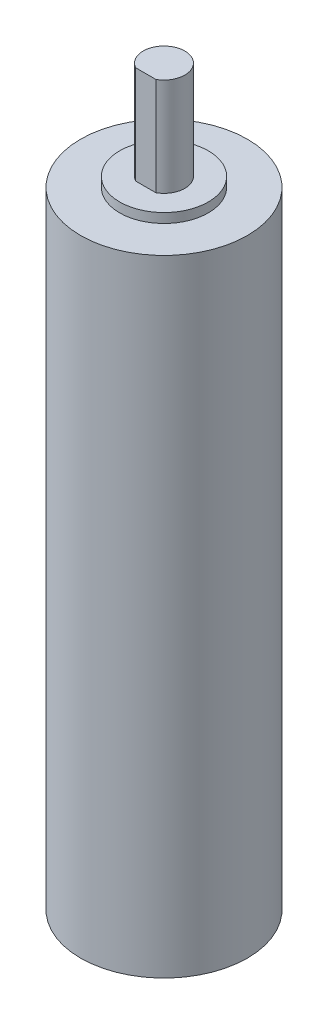
ISO-10303-21;
HEADER;
FILE_DESCRIPTION(('STEP AP214'),'2;1');
FILE_NAME('part.step','',(''),(''),'','','');
FILE_SCHEMA(('AUTOMOTIVE_DESIGN { 1 0 10303 214 1 1 1 1 }'));
ENDSEC;
DATA;
#1=APPLICATION_CONTEXT('core data for automotive mechanical design processes');
#2=APPLICATION_PROTOCOL_DEFINITION('international standard','automotive_design',2000,#1);
#3=PRODUCT_CONTEXT('',#1,'mechanical');
#4=PRODUCT('Part','Part','',(#3));
#5=PRODUCT_RELATED_PRODUCT_CATEGORY('part','',(#4));
#6=PRODUCT_DEFINITION_FORMATION('','',#4);
#7=PRODUCT_DEFINITION_CONTEXT('part definition',#1,'design');
#8=PRODUCT_DEFINITION('design','',#6,#7);
#9=PRODUCT_DEFINITION_SHAPE('','',#8);
#10=(LENGTH_UNIT() NAMED_UNIT(*) SI_UNIT(.MILLI.,.METRE.));
#11=(NAMED_UNIT(*) PLANE_ANGLE_UNIT() SI_UNIT($,.RADIAN.));
#12=(NAMED_UNIT(*) SI_UNIT($,.STERADIAN.) SOLID_ANGLE_UNIT());
#13=UNCERTAINTY_MEASURE_WITH_UNIT(LENGTH_MEASURE(1.E-05),#10,'distance_accuracy_value','');
#14=(GEOMETRIC_REPRESENTATION_CONTEXT(3) GLOBAL_UNCERTAINTY_ASSIGNED_CONTEXT((#13)) GLOBAL_UNIT_ASSIGNED_CONTEXT((#10,
#11,#12)) REPRESENTATION_CONTEXT('',''));
#15=CARTESIAN_POINT('',(0.,0.,0.));
#16=DIRECTION('',(0.,0.,1.));
#17=DIRECTION('',(1.,0.,0.));
#18=AXIS2_PLACEMENT_3D('',#15,#16,#17);
#19=CARTESIAN_POINT('',(0.,120.,0.));
#20=DIRECTION('',(0.,-1.,0.));
#21=DIRECTION('',(0.,0.,-1.));
#22=AXIS2_PLACEMENT_3D('',#19,#20,#21);
#23=CYLINDRICAL_SURFACE('',#22,16.);
#24=CARTESIAN_POINT('',(0.,120.,0.));
#25=DIRECTION('',(0.,1.,0.));
#26=DIRECTION('',(0.,0.,1.));
#27=AXIS2_PLACEMENT_3D('',#24,#25,#26);
#28=CIRCLE('',#27,16.);
#29=CARTESIAN_POINT('',(0.,120.,16.));
#30=VERTEX_POINT('',#29);
#31=EDGE_CURVE('E48',#30,#30,#28,.T.);
#32=ORIENTED_EDGE('',*,*,#31,.F.);
#33=EDGE_LOOP('',(#32));
#34=FACE_BOUND('',#33,.T.);
#35=CARTESIAN_POINT('',(0.,0.,0.));
#36=DIRECTION('',(0.,1.,0.));
#37=DIRECTION('',(0.,0.,1.));
#38=AXIS2_PLACEMENT_3D('',#35,#36,#37);
#39=CIRCLE('',#38,16.);
#40=CARTESIAN_POINT('',(0.,0.,16.));
#41=VERTEX_POINT('',#40);
#42=EDGE_CURVE('E42',#41,#41,#39,.T.);
#43=ORIENTED_EDGE('',*,*,#42,.T.);
#44=EDGE_LOOP('',(#43));
#45=FACE_BOUND('',#44,.T.);
#46=ADVANCED_FACE('F39',(#34,#45),#23,.T.);
#47=CARTESIAN_POINT('',(0.,120.,0.));
#48=DIRECTION('',(0.,1.,0.));
#49=DIRECTION('',(0.,0.,1.));
#50=AXIS2_PLACEMENT_3D('',#47,#48,#49);
#51=PLANE('',#50);
#52=CARTESIAN_POINT('',(0.,120.,0.));
#53=DIRECTION('',(0.,1.,0.));
#54=DIRECTION('',(0.,0.,1.));
#55=AXIS2_PLACEMENT_3D('',#52,#53,#54);
#56=CIRCLE('',#55,8.5);
#57=CARTESIAN_POINT('',(0.,120.,8.5));
#58=VERTEX_POINT('',#57);
#59=EDGE_CURVE('E11',#58,#58,#56,.T.);
#60=ORIENTED_EDGE('',*,*,#59,.F.);
#61=EDGE_LOOP('',(#60));
#62=FACE_BOUND('',#61,.T.);
#63=ORIENTED_EDGE('',*,*,#31,.T.);
#64=EDGE_LOOP('',(#63));
#65=FACE_BOUND('',#64,.T.);
#66=ADVANCED_FACE('F107',(#62,#65),#51,.T.);
#67=CARTESIAN_POINT('',(0.,0.,0.));
#68=DIRECTION('',(0.,1.,0.));
#69=DIRECTION('',(0.,0.,1.));
#70=AXIS2_PLACEMENT_3D('',#67,#68,#69);
#71=PLANE('',#70);
#72=ORIENTED_EDGE('',*,*,#42,.F.);
#73=EDGE_LOOP('',(#72));
#74=FACE_BOUND('',#73,.T.);
#75=ADVANCED_FACE('F104',(#74),#71,.F.);
#76=CARTESIAN_POINT('',(0.,121.82,0.));
#77=DIRECTION('',(0.,-1.,0.));
#78=DIRECTION('',(0.,0.,-1.));
#79=AXIS2_PLACEMENT_3D('',#76,#77,#78);
#80=CYLINDRICAL_SURFACE('',#79,8.5);
#81=CARTESIAN_POINT('',(0.,121.82,0.));
#82=DIRECTION('',(0.,1.,0.));
#83=DIRECTION('',(0.,0.,1.));
#84=AXIS2_PLACEMENT_3D('',#81,#82,#83);
#85=CIRCLE('',#84,8.5);
#86=CARTESIAN_POINT('',(0.,121.82,8.5));
#87=VERTEX_POINT('',#86);
#88=EDGE_CURVE('E89',#87,#87,#85,.T.);
#89=ORIENTED_EDGE('',*,*,#88,.F.);
#90=EDGE_LOOP('',(#89));
#91=FACE_BOUND('',#90,.T.);
#92=ORIENTED_EDGE('',*,*,#59,.T.);
#93=EDGE_LOOP('',(#92));
#94=FACE_BOUND('',#93,.T.);
#95=ADVANCED_FACE('F106',(#91,#94),#80,.T.);
#96=CARTESIAN_POINT('',(0.,121.82,0.));
#97=DIRECTION('',(0.,1.,0.));
#98=DIRECTION('',(0.,0.,1.));
#99=AXIS2_PLACEMENT_3D('',#96,#97,#98);
#100=PLANE('',#99);
#101=CARTESIAN_POINT('',(0.,121.82,0.));
#102=DIRECTION('',(0.,1.,0.));
#103=DIRECTION('',(0.,0.,1.));
#104=AXIS2_PLACEMENT_3D('',#101,#102,#103);
#105=CIRCLE('',#104,4.);
#106=CARTESIAN_POINT('',(1.93649167310371,121.82,3.5));
#107=VERTEX_POINT('',#106);
#108=CARTESIAN_POINT('',(-1.93649167310371,121.82,3.5));
#109=VERTEX_POINT('',#108);
#110=EDGE_CURVE('E68',#107,#109,#105,.T.);
#111=ORIENTED_EDGE('',*,*,#110,.F.);
#112=DIRECTION('',(1.,0.,0.));
#113=VECTOR('',#112,1.);
#114=CARTESIAN_POINT('',(-1.93649167310371,121.82,3.5));
#115=LINE('',#114,#113);
#116=EDGE_CURVE('E55',#109,#107,#115,.T.);
#117=ORIENTED_EDGE('',*,*,#116,.F.);
#118=EDGE_LOOP('',(#111,#117));
#119=FACE_BOUND('',#118,.T.);
#120=ORIENTED_EDGE('',*,*,#88,.T.);
#121=EDGE_LOOP('',(#120));
#122=FACE_BOUND('',#121,.T.);
#123=ADVANCED_FACE('F69',(#119,#122),#100,.T.);
#124=CARTESIAN_POINT('',(0.,140.64,0.));
#125=DIRECTION('',(0.,-1.,0.));
#126=DIRECTION('',(0.,0.,-1.));
#127=AXIS2_PLACEMENT_3D('',#124,#125,#126);
#128=CYLINDRICAL_SURFACE('',#127,4.);
#129=ORIENTED_EDGE('',*,*,#110,.T.);
#130=DIRECTION('',(0.,-1.,0.));
#131=VECTOR('',#130,1.);
#132=CARTESIAN_POINT('',(-1.93649167310371,140.64,3.5));
#133=LINE('',#132,#131);
#134=CARTESIAN_POINT('',(-1.93649167310371,140.64,3.5));
#135=VERTEX_POINT('',#134);
#136=EDGE_CURVE('E80',#135,#109,#133,.T.);
#137=ORIENTED_EDGE('',*,*,#136,.F.);
#138=CARTESIAN_POINT('',(0.,140.64,0.));
#139=DIRECTION('',(0.,1.,0.));
#140=DIRECTION('',(0.,0.,1.));
#141=AXIS2_PLACEMENT_3D('',#138,#139,#140);
#142=CIRCLE('',#141,4.);
#143=CARTESIAN_POINT('',(1.93649167310371,140.64,3.5));
#144=VERTEX_POINT('',#143);
#145=EDGE_CURVE('E82',#144,#135,#142,.T.);
#146=ORIENTED_EDGE('',*,*,#145,.F.);
#147=DIRECTION('',(0.,-1.,0.));
#148=VECTOR('',#147,1.);
#149=CARTESIAN_POINT('',(1.93649167310371,140.64,3.5));
#150=LINE('',#149,#148);
#151=EDGE_CURVE('E78',#144,#107,#150,.T.);
#152=ORIENTED_EDGE('',*,*,#151,.T.);
#153=EDGE_LOOP('',(#129,#137,#146,#152));
#154=FACE_BOUND('',#153,.T.);
#155=ADVANCED_FACE('F84',(#154),#128,.T.);
#156=CARTESIAN_POINT('',(-1.93649167310371,140.64,3.5));
#157=DIRECTION('',(0.,0.,-1.));
#158=DIRECTION('',(-1.,0.,0.));
#159=AXIS2_PLACEMENT_3D('',#156,#157,#158);
#160=PLANE('',#159);
#161=ORIENTED_EDGE('',*,*,#116,.T.);
#162=ORIENTED_EDGE('',*,*,#151,.F.);
#163=DIRECTION('',(1.,0.,0.));
#164=VECTOR('',#163,1.);
#165=CARTESIAN_POINT('',(-1.93649167310371,140.64,3.5));
#166=LINE('',#165,#164);
#167=EDGE_CURVE('E63',#135,#144,#166,.T.);
#168=ORIENTED_EDGE('',*,*,#167,.F.);
#169=ORIENTED_EDGE('',*,*,#136,.T.);
#170=EDGE_LOOP('',(#161,#162,#168,#169));
#171=FACE_BOUND('',#170,.T.);
#172=ADVANCED_FACE('F77',(#171),#160,.F.);
#173=CARTESIAN_POINT('',(0.,140.64,0.));
#174=DIRECTION('',(0.,1.,0.));
#175=DIRECTION('',(0.,0.,1.));
#176=AXIS2_PLACEMENT_3D('',#173,#174,#175);
#177=PLANE('',#176);
#178=ORIENTED_EDGE('',*,*,#145,.T.);
#179=ORIENTED_EDGE('',*,*,#167,.T.);
#180=EDGE_LOOP('',(#178,#179));
#181=FACE_BOUND('',#180,.T.);
#182=ADVANCED_FACE('F157',(#181),#177,.T.);
#183=CLOSED_SHELL('',(#46,#66,#75,#95,#123,#155,#172,#182));
#184=MANIFOLD_SOLID_BREP('B2',#183);
#185=ADVANCED_BREP_SHAPE_REPRESENTATION('',(#18,#184),#14);
#186=SHAPE_DEFINITION_REPRESENTATION(#9,#185);
ENDSEC;
END-ISO-10303-21;
